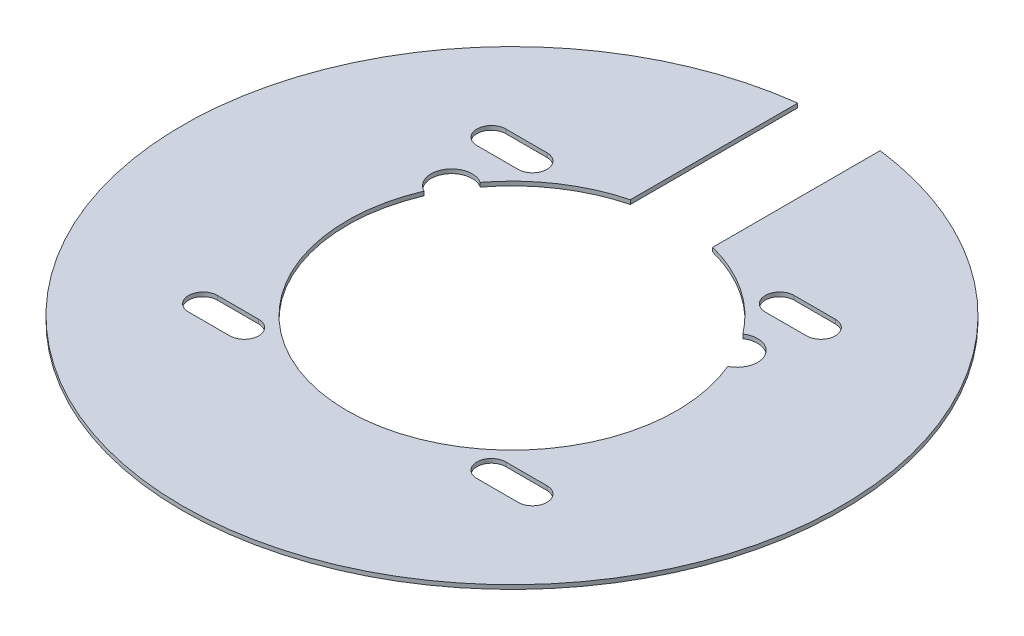
ISO-10303-21;
HEADER;
FILE_DESCRIPTION(('STEP AP214'),'2;1');
FILE_NAME('part.step','',(''),(''),'','','');
FILE_SCHEMA(('AUTOMOTIVE_DESIGN { 1 0 10303 214 1 1 1 1 }'));
ENDSEC;
DATA;
#1=APPLICATION_CONTEXT('core data for automotive mechanical design processes');
#2=APPLICATION_PROTOCOL_DEFINITION('international standard','automotive_design',2000,#1);
#3=PRODUCT_CONTEXT('',#1,'mechanical');
#4=PRODUCT('Part','Part','',(#3));
#5=PRODUCT_RELATED_PRODUCT_CATEGORY('part','',(#4));
#6=PRODUCT_DEFINITION_FORMATION('','',#4);
#7=PRODUCT_DEFINITION_CONTEXT('part definition',#1,'design');
#8=PRODUCT_DEFINITION('design','',#6,#7);
#9=PRODUCT_DEFINITION_SHAPE('','',#8);
#10=(LENGTH_UNIT() NAMED_UNIT(*) SI_UNIT(.MILLI.,.METRE.));
#11=(NAMED_UNIT(*) PLANE_ANGLE_UNIT() SI_UNIT($,.RADIAN.));
#12=(NAMED_UNIT(*) SI_UNIT($,.STERADIAN.) SOLID_ANGLE_UNIT());
#13=UNCERTAINTY_MEASURE_WITH_UNIT(LENGTH_MEASURE(1.E-05),#10,'distance_accuracy_value','');
#14=(GEOMETRIC_REPRESENTATION_CONTEXT(3) GLOBAL_UNCERTAINTY_ASSIGNED_CONTEXT((#13)) GLOBAL_UNIT_ASSIGNED_CONTEXT((#10,
#11,#12)) REPRESENTATION_CONTEXT('',''));
#15=CARTESIAN_POINT('',(0.,0.,0.));
#16=DIRECTION('',(0.,0.,1.));
#17=DIRECTION('',(1.,0.,0.));
#18=AXIS2_PLACEMENT_3D('',#15,#16,#17);
#19=CARTESIAN_POINT('',(0.,1.,0.));
#20=DIRECTION('',(0.,-1.,0.));
#21=DIRECTION('',(0.,0.,-1.));
#22=AXIS2_PLACEMENT_3D('',#19,#20,#21);
#23=CYLINDRICAL_SURFACE('',#22,40.);
#24=CARTESIAN_POINT('',(0.,1.,0.));
#25=DIRECTION('',(0.,-1.,0.));
#26=DIRECTION('',(0.,0.,1.));
#27=AXIS2_PLACEMENT_3D('',#24,#25,#26);
#28=CIRCLE('',#27,40.);
#29=CARTESIAN_POINT('',(-31.8752708029025,1.,-24.1654114643561));
#30=VERTEX_POINT('',#29);
#31=CARTESIAN_POINT('',(-10.,1.,-38.7298334620742));
#32=VERTEX_POINT('',#31);
#33=EDGE_CURVE('E210',#30,#32,#28,.T.);
#34=ORIENTED_EDGE('',*,*,#33,.F.);
#35=DIRECTION('',(0.,1.,0.));
#36=VECTOR('',#35,1.);
#37=CARTESIAN_POINT('',(-31.8752708029025,0.5,-24.1654114643561));
#38=LINE('',#37,#36);
#39=CARTESIAN_POINT('',(-31.8752708029025,0.,-24.1654114643561));
#40=VERTEX_POINT('',#39);
#41=EDGE_CURVE('E199',#30,#40,#38,.F.);
#42=ORIENTED_EDGE('',*,*,#41,.T.);
#43=CARTESIAN_POINT('',(0.,0.,0.));
#44=DIRECTION('',(0.,-1.,0.));
#45=DIRECTION('',(0.,0.,1.));
#46=AXIS2_PLACEMENT_3D('',#43,#44,#45);
#47=CIRCLE('',#46,40.);
#48=CARTESIAN_POINT('',(-10.,0.,-38.7298334620742));
#49=VERTEX_POINT('',#48);
#50=EDGE_CURVE('E208',#40,#49,#47,.T.);
#51=ORIENTED_EDGE('',*,*,#50,.T.);
#52=DIRECTION('',(0.,-1.,0.));
#53=VECTOR('',#52,1.);
#54=CARTESIAN_POINT('',(-10.,1.,-38.7298334620742));
#55=LINE('',#54,#53);
#56=EDGE_CURVE('E239',#32,#49,#55,.T.);
#57=ORIENTED_EDGE('',*,*,#56,.F.);
#58=EDGE_LOOP('',(#34,#42,#51,#57));
#59=FACE_BOUND('',#58,.T.);
#60=ADVANCED_FACE('F40',(#59),#23,.F.);
#61=CARTESIAN_POINT('',(36.8654956224873,0.,-15.522088535644));
#62=VERTEX_POINT('',#61);
#63=CARTESIAN_POINT('',(-36.8654956224873,0.,-15.522088535644));
#64=VERTEX_POINT('',#63);
#65=EDGE_CURVE('E217',#62,#64,#47,.T.);
#66=ORIENTED_EDGE('',*,*,#65,.T.);
#67=DIRECTION('',(0.,1.,0.));
#68=VECTOR('',#67,1.);
#69=CARTESIAN_POINT('',(-36.8654956224873,0.5,-15.522088535644));
#70=LINE('',#69,#68);
#71=CARTESIAN_POINT('',(-36.8654956224873,1.,-15.522088535644));
#72=VERTEX_POINT('',#71);
#73=EDGE_CURVE('E55',#64,#72,#70,.T.);
#74=ORIENTED_EDGE('',*,*,#73,.T.);
#75=CARTESIAN_POINT('',(36.8654956224873,1.,-15.522088535644));
#76=VERTEX_POINT('',#75);
#77=EDGE_CURVE('E278',#76,#72,#28,.T.);
#78=ORIENTED_EDGE('',*,*,#77,.F.);
#79=DIRECTION('',(0.,1.,0.));
#80=VECTOR('',#79,1.);
#81=CARTESIAN_POINT('',(36.8654956224873,0.5,-15.522088535644));
#82=LINE('',#81,#80);
#83=EDGE_CURVE('E289',#76,#62,#82,.F.);
#84=ORIENTED_EDGE('',*,*,#83,.T.);
#85=EDGE_LOOP('',(#66,#74,#78,#84));
#86=FACE_BOUND('',#85,.T.);
#87=ADVANCED_FACE('F484',(#86),#23,.F.);
#88=CARTESIAN_POINT('',(0.,1.,0.));
#89=DIRECTION('',(0.,-1.,0.));
#90=DIRECTION('',(0.,0.,-1.));
#91=AXIS2_PLACEMENT_3D('',#88,#89,#90);
#92=CYLINDRICAL_SURFACE('',#91,80.);
#93=CARTESIAN_POINT('',(0.,0.,0.));
#94=DIRECTION('',(0.,1.,0.));
#95=DIRECTION('',(0.,0.,1.));
#96=AXIS2_PLACEMENT_3D('',#93,#94,#95);
#97=CIRCLE('',#96,80.);
#98=CARTESIAN_POINT('',(-10.,0.,-79.3725393319377));
#99=VERTEX_POINT('',#98);
#100=CARTESIAN_POINT('',(10.,0.,-79.3725393319377));
#101=VERTEX_POINT('',#100);
#102=EDGE_CURVE('E221',#99,#101,#97,.T.);
#103=ORIENTED_EDGE('',*,*,#102,.T.);
#104=DIRECTION('',(0.,-1.,0.));
#105=VECTOR('',#104,1.);
#106=CARTESIAN_POINT('',(10.,1.,-79.3725393319377));
#107=LINE('',#106,#105);
#108=CARTESIAN_POINT('',(10.,1.,-79.3725393319377));
#109=VERTEX_POINT('',#108);
#110=EDGE_CURVE('E48',#109,#101,#107,.T.);
#111=ORIENTED_EDGE('',*,*,#110,.F.);
#112=CARTESIAN_POINT('',(0.,1.,0.));
#113=DIRECTION('',(0.,1.,0.));
#114=DIRECTION('',(0.,0.,1.));
#115=AXIS2_PLACEMENT_3D('',#112,#113,#114);
#116=CIRCLE('',#115,80.);
#117=CARTESIAN_POINT('',(-10.,1.,-79.3725393319377));
#118=VERTEX_POINT('',#117);
#119=EDGE_CURVE('E228',#118,#109,#116,.T.);
#120=ORIENTED_EDGE('',*,*,#119,.F.);
#121=DIRECTION('',(0.,-1.,0.));
#122=VECTOR('',#121,1.);
#123=CARTESIAN_POINT('',(-10.,1.,-79.3725393319377));
#124=LINE('',#123,#122);
#125=EDGE_CURVE('E237',#118,#99,#124,.T.);
#126=ORIENTED_EDGE('',*,*,#125,.T.);
#127=EDGE_LOOP('',(#103,#111,#120,#126));
#128=FACE_BOUND('',#127,.T.);
#129=ADVANCED_FACE('F42',(#128),#92,.T.);
#130=CARTESIAN_POINT('',(10.,1.,-79.3725393319377));
#131=DIRECTION('',(1.,0.,0.));
#132=DIRECTION('',(0.,0.,-1.));
#133=AXIS2_PLACEMENT_3D('',#130,#131,#132);
#134=PLANE('',#133);
#135=DIRECTION('',(0.,0.,1.));
#136=VECTOR('',#135,1.);
#137=CARTESIAN_POINT('',(10.,0.,-79.3725393319377));
#138=LINE('',#137,#136);
#139=CARTESIAN_POINT('',(9.99999999999998,0.,-38.7298334620742));
#140=VERTEX_POINT('',#139);
#141=EDGE_CURVE('E218',#101,#140,#138,.T.);
#142=ORIENTED_EDGE('',*,*,#141,.T.);
#143=DIRECTION('',(0.,-1.,0.));
#144=VECTOR('',#143,1.);
#145=CARTESIAN_POINT('',(9.99999999999998,1.,-38.7298334620742));
#146=LINE('',#145,#144);
#147=CARTESIAN_POINT('',(9.99999999999998,1.,-38.7298334620742));
#148=VERTEX_POINT('',#147);
#149=EDGE_CURVE('E242',#148,#140,#146,.T.);
#150=ORIENTED_EDGE('',*,*,#149,.F.);
#151=DIRECTION('',(0.,0.,1.));
#152=VECTOR('',#151,1.);
#153=CARTESIAN_POINT('',(10.,1.,-79.3725393319377));
#154=LINE('',#153,#152);
#155=EDGE_CURVE('E234',#109,#148,#154,.T.);
#156=ORIENTED_EDGE('',*,*,#155,.F.);
#157=ORIENTED_EDGE('',*,*,#110,.T.);
#158=EDGE_LOOP('',(#142,#150,#156,#157));
#159=FACE_BOUND('',#158,.T.);
#160=ADVANCED_FACE('F247',(#159),#134,.F.);
#161=CARTESIAN_POINT('',(31.8752708029025,0.,-24.1654114643561));
#162=VERTEX_POINT('',#161);
#163=EDGE_CURVE('E220',#140,#162,#47,.T.);
#164=ORIENTED_EDGE('',*,*,#163,.T.);
#165=DIRECTION('',(0.,1.,0.));
#166=VECTOR('',#165,1.);
#167=CARTESIAN_POINT('',(31.8752708029025,0.5,-24.1654114643561));
#168=LINE('',#167,#166);
#169=CARTESIAN_POINT('',(31.8752708029025,1.,-24.1654114643561));
#170=VERTEX_POINT('',#169);
#171=EDGE_CURVE('E62',#162,#170,#168,.T.);
#172=ORIENTED_EDGE('',*,*,#171,.T.);
#173=EDGE_CURVE('E259',#148,#170,#28,.T.);
#174=ORIENTED_EDGE('',*,*,#173,.F.);
#175=ORIENTED_EDGE('',*,*,#149,.T.);
#176=EDGE_LOOP('',(#164,#172,#174,#175));
#177=FACE_BOUND('',#176,.T.);
#178=ADVANCED_FACE('F288',(#177),#23,.F.);
#179=CARTESIAN_POINT('',(-10.,1.,-79.3725393319377));
#180=DIRECTION('',(-1.,0.,0.));
#181=DIRECTION('',(0.,0.,1.));
#182=AXIS2_PLACEMENT_3D('',#179,#180,#181);
#183=PLANE('',#182);
#184=DIRECTION('',(0.,0.,-1.));
#185=VECTOR('',#184,1.);
#186=CARTESIAN_POINT('',(-10.,0.,-79.3725393319377));
#187=LINE('',#186,#185);
#188=EDGE_CURVE('E216',#49,#99,#187,.T.);
#189=ORIENTED_EDGE('',*,*,#188,.T.);
#190=ORIENTED_EDGE('',*,*,#125,.F.);
#191=DIRECTION('',(0.,0.,-1.));
#192=VECTOR('',#191,1.);
#193=CARTESIAN_POINT('',(-10.,1.,-79.3725393319377));
#194=LINE('',#193,#192);
#195=EDGE_CURVE('E240',#32,#118,#194,.T.);
#196=ORIENTED_EDGE('',*,*,#195,.F.);
#197=ORIENTED_EDGE('',*,*,#56,.T.);
#198=EDGE_LOOP('',(#189,#190,#196,#197));
#199=FACE_BOUND('',#198,.T.);
#200=ADVANCED_FACE('F492',(#199),#183,.F.);
#201=CARTESIAN_POINT('',(0.,1.,0.));
#202=DIRECTION('',(0.,1.,0.));
#203=DIRECTION('',(0.,0.,1.));
#204=AXIS2_PLACEMENT_3D('',#201,#202,#203);
#205=PLANE('',#204);
#206=CARTESIAN_POINT('',(-34.6410161513775,1.,-20.0000000000001));
#207=DIRECTION('',(0.,1.,0.));
#208=DIRECTION('',(0.,0.,-1.));
#209=AXIS2_PLACEMENT_3D('',#206,#207,#208);
#210=CIRCLE('',#209,5.);
#211=EDGE_CURVE('E725',#30,#72,#210,.T.);
#212=ORIENTED_EDGE('',*,*,#211,.F.);
#213=ORIENTED_EDGE('',*,*,#33,.T.);
#214=ORIENTED_EDGE('',*,*,#195,.T.);
#215=ORIENTED_EDGE('',*,*,#119,.T.);
#216=ORIENTED_EDGE('',*,*,#155,.T.);
#217=ORIENTED_EDGE('',*,*,#173,.T.);
#218=CARTESIAN_POINT('',(34.6410161513775,1.,-20.0000000000001));
#219=DIRECTION('',(0.,1.,0.));
#220=DIRECTION('',(0.,0.,1.));
#221=AXIS2_PLACEMENT_3D('',#218,#219,#220);
#222=CIRCLE('',#221,5.);
#223=EDGE_CURVE('E211',#76,#170,#222,.T.);
#224=ORIENTED_EDGE('',*,*,#223,.F.);
#225=ORIENTED_EDGE('',*,*,#77,.T.);
#226=EDGE_LOOP('',(#212,#213,#214,#215,#216,#217,#224,#225));
#227=FACE_BOUND('',#226,.T.);
#228=CARTESIAN_POINT('',(30.,1.,-35.));
#229=DIRECTION('',(0.,1.,0.));
#230=DIRECTION('',(0.,0.,1.));
#231=AXIS2_PLACEMENT_3D('',#228,#229,#230);
#232=CIRCLE('',#231,3.5);
#233=CARTESIAN_POINT('',(30.,1.,-38.5));
#234=VERTEX_POINT('',#233);
#235=CARTESIAN_POINT('',(30.,1.,-31.5));
#236=VERTEX_POINT('',#235);
#237=EDGE_CURVE('E313',#234,#236,#232,.T.);
#238=ORIENTED_EDGE('',*,*,#237,.F.);
#239=DIRECTION('',(-1.,0.,0.));
#240=VECTOR('',#239,1.);
#241=CARTESIAN_POINT('',(30.,1.,-38.5));
#242=LINE('',#241,#240);
#243=CARTESIAN_POINT('',(40.,1.,-38.5));
#244=VERTEX_POINT('',#243);
#245=EDGE_CURVE('E303',#244,#234,#242,.T.);
#246=ORIENTED_EDGE('',*,*,#245,.F.);
#247=CARTESIAN_POINT('',(40.,1.,-34.9999999999998));
#248=DIRECTION('',(0.,1.,0.));
#249=DIRECTION('',(0.,0.,1.));
#250=AXIS2_PLACEMENT_3D('',#247,#248,#249);
#251=CIRCLE('',#250,3.5);
#252=CARTESIAN_POINT('',(40.,1.,-31.4999999999998));
#253=VERTEX_POINT('',#252);
#254=EDGE_CURVE('E332',#253,#244,#251,.T.);
#255=ORIENTED_EDGE('',*,*,#254,.F.);
#256=DIRECTION('',(1.,0.,0.));
#257=VECTOR('',#256,1.);
#258=CARTESIAN_POINT('',(30.,1.,-31.5));
#259=LINE('',#258,#257);
#260=EDGE_CURVE('E317',#236,#253,#259,.T.);
#261=ORIENTED_EDGE('',*,*,#260,.F.);
#262=EDGE_LOOP('',(#238,#246,#255,#261));
#263=FACE_BOUND('',#262,.T.);
#264=CARTESIAN_POINT('',(30.,1.,35.));
#265=DIRECTION('',(0.,1.,0.));
#266=DIRECTION('',(0.,0.,1.));
#267=AXIS2_PLACEMENT_3D('',#264,#265,#266);
#268=CIRCLE('',#267,3.50000000000009);
#269=CARTESIAN_POINT('',(30.,1.,31.4999999999999));
#270=VERTEX_POINT('',#269);
#271=CARTESIAN_POINT('',(30.,1.,38.5000000000001));
#272=VERTEX_POINT('',#271);
#273=EDGE_CURVE('E357',#270,#272,#268,.T.);
#274=ORIENTED_EDGE('',*,*,#273,.F.);
#275=DIRECTION('',(-1.,0.,0.));
#276=VECTOR('',#275,1.);
#277=CARTESIAN_POINT('',(30.,1.,31.4999999999999));
#278=LINE('',#277,#276);
#279=CARTESIAN_POINT('',(40.,1.,31.4999999999999));
#280=VERTEX_POINT('',#279);
#281=EDGE_CURVE('E347',#280,#270,#278,.T.);
#282=ORIENTED_EDGE('',*,*,#281,.F.);
#283=CARTESIAN_POINT('',(40.,1.,35.));
#284=DIRECTION('',(0.,1.,0.));
#285=DIRECTION('',(0.,0.,1.));
#286=AXIS2_PLACEMENT_3D('',#283,#284,#285);
#287=CIRCLE('',#286,3.50000000000009);
#288=CARTESIAN_POINT('',(40.,1.,38.5000000000001));
#289=VERTEX_POINT('',#288);
#290=EDGE_CURVE('E374',#289,#280,#287,.T.);
#291=ORIENTED_EDGE('',*,*,#290,.F.);
#292=DIRECTION('',(1.,0.,0.));
#293=VECTOR('',#292,1.);
#294=CARTESIAN_POINT('',(30.,1.,38.5000000000001));
#295=LINE('',#294,#293);
#296=EDGE_CURVE('E361',#272,#289,#295,.T.);
#297=ORIENTED_EDGE('',*,*,#296,.F.);
#298=EDGE_LOOP('',(#274,#282,#291,#297));
#299=FACE_BOUND('',#298,.T.);
#300=CARTESIAN_POINT('',(-40.,1.,34.9999999999999));
#301=DIRECTION('',(0.,1.,0.));
#302=DIRECTION('',(0.,0.,1.));
#303=AXIS2_PLACEMENT_3D('',#300,#301,#302);
#304=CIRCLE('',#303,3.50000000000009);
#305=CARTESIAN_POINT('',(-40.,1.,31.4999999999999));
#306=VERTEX_POINT('',#305);
#307=CARTESIAN_POINT('',(-40.,1.,38.5000000000001));
#308=VERTEX_POINT('',#307);
#309=EDGE_CURVE('E293',#306,#308,#304,.T.);
#310=ORIENTED_EDGE('',*,*,#309,.F.);
#311=DIRECTION('',(-1.,0.,0.));
#312=VECTOR('',#311,1.);
#313=CARTESIAN_POINT('',(-40.,1.,31.4999999999999));
#314=LINE('',#313,#312);
#315=CARTESIAN_POINT('',(-30.,1.,31.4999999999999));
#316=VERTEX_POINT('',#315);
#317=EDGE_CURVE('E387',#316,#306,#314,.T.);
#318=ORIENTED_EDGE('',*,*,#317,.F.);
#319=CARTESIAN_POINT('',(-30.,1.,35.0000000000001));
#320=DIRECTION('',(0.,1.,0.));
#321=DIRECTION('',(0.,0.,1.));
#322=AXIS2_PLACEMENT_3D('',#319,#320,#321);
#323=CIRCLE('',#322,3.50000000000009);
#324=CARTESIAN_POINT('',(-30.,1.,38.5000000000002));
#325=VERTEX_POINT('',#324);
#326=EDGE_CURVE('E412',#325,#316,#323,.T.);
#327=ORIENTED_EDGE('',*,*,#326,.F.);
#328=DIRECTION('',(1.,0.,0.));
#329=VECTOR('',#328,1.);
#330=CARTESIAN_POINT('',(-40.,1.,38.5000000000001));
#331=LINE('',#330,#329);
#332=EDGE_CURVE('E400',#308,#325,#331,.T.);
#333=ORIENTED_EDGE('',*,*,#332,.F.);
#334=EDGE_LOOP('',(#310,#318,#327,#333));
#335=FACE_BOUND('',#334,.T.);
#336=CARTESIAN_POINT('',(-40.,1.,-35.));
#337=DIRECTION('',(0.,1.,0.));
#338=DIRECTION('',(0.,0.,1.));
#339=AXIS2_PLACEMENT_3D('',#336,#337,#338);
#340=CIRCLE('',#339,3.5);
#341=CARTESIAN_POINT('',(-40.,1.,-38.5));
#342=VERTEX_POINT('',#341);
#343=CARTESIAN_POINT('',(-40.,1.,-31.5));
#344=VERTEX_POINT('',#343);
#345=EDGE_CURVE('E336',#342,#344,#340,.T.);
#346=ORIENTED_EDGE('',*,*,#345,.F.);
#347=DIRECTION('',(-1.,0.,0.));
#348=VECTOR('',#347,1.);
#349=CARTESIAN_POINT('',(-40.,1.,-38.5));
#350=LINE('',#349,#348);
#351=CARTESIAN_POINT('',(-30.,1.,-38.5));
#352=VERTEX_POINT('',#351);
#353=EDGE_CURVE('E425',#352,#342,#350,.T.);
#354=ORIENTED_EDGE('',*,*,#353,.F.);
#355=CARTESIAN_POINT('',(-30.,1.,-35.));
#356=DIRECTION('',(0.,1.,0.));
#357=DIRECTION('',(0.,0.,1.));
#358=AXIS2_PLACEMENT_3D('',#355,#356,#357);
#359=CIRCLE('',#358,3.5);
#360=CARTESIAN_POINT('',(-30.,1.,-31.5));
#361=VERTEX_POINT('',#360);
#362=EDGE_CURVE('E445',#361,#352,#359,.T.);
#363=ORIENTED_EDGE('',*,*,#362,.F.);
#364=DIRECTION('',(1.,0.,0.));
#365=VECTOR('',#364,1.);
#366=CARTESIAN_POINT('',(-40.,1.,-31.5));
#367=LINE('',#366,#365);
#368=EDGE_CURVE('E436',#344,#361,#367,.T.);
#369=ORIENTED_EDGE('',*,*,#368,.F.);
#370=EDGE_LOOP('',(#346,#354,#363,#369));
#371=FACE_BOUND('',#370,.T.);
#372=ADVANCED_FACE('F285',(#227,#263,#299,#335,#371),#205,.T.);
#373=CARTESIAN_POINT('',(0.,0.,0.));
#374=DIRECTION('',(0.,1.,0.));
#375=DIRECTION('',(0.,0.,1.));
#376=AXIS2_PLACEMENT_3D('',#373,#374,#375);
#377=PLANE('',#376);
#378=DIRECTION('',(-1.,0.,0.));
#379=VECTOR('',#378,1.);
#380=CARTESIAN_POINT('',(30.,0.,-38.5));
#381=LINE('',#380,#379);
#382=CARTESIAN_POINT('',(40.,0.,-38.5));
#383=VERTEX_POINT('',#382);
#384=CARTESIAN_POINT('',(30.,0.,-38.5));
#385=VERTEX_POINT('',#384);
#386=EDGE_CURVE('E309',#383,#385,#381,.T.);
#387=ORIENTED_EDGE('',*,*,#386,.T.);
#388=CARTESIAN_POINT('',(30.,0.,-35.));
#389=DIRECTION('',(0.,1.,0.));
#390=DIRECTION('',(0.,0.,1.));
#391=AXIS2_PLACEMENT_3D('',#388,#389,#390);
#392=CIRCLE('',#391,3.5);
#393=CARTESIAN_POINT('',(30.,0.,-31.5));
#394=VERTEX_POINT('',#393);
#395=EDGE_CURVE('E299',#385,#394,#392,.T.);
#396=ORIENTED_EDGE('',*,*,#395,.T.);
#397=DIRECTION('',(1.,0.,0.));
#398=VECTOR('',#397,1.);
#399=CARTESIAN_POINT('',(30.,0.,-31.5));
#400=LINE('',#399,#398);
#401=CARTESIAN_POINT('',(40.,0.,-31.5));
#402=VERTEX_POINT('',#401);
#403=EDGE_CURVE('E302',#394,#402,#400,.T.);
#404=ORIENTED_EDGE('',*,*,#403,.T.);
#405=CARTESIAN_POINT('',(40.,0.,-34.9999999999998));
#406=DIRECTION('',(0.,1.,0.));
#407=DIRECTION('',(0.,0.,1.));
#408=AXIS2_PLACEMENT_3D('',#405,#406,#407);
#409=CIRCLE('',#408,3.5);
#410=EDGE_CURVE('E306',#402,#383,#409,.T.);
#411=ORIENTED_EDGE('',*,*,#410,.T.);
#412=EDGE_LOOP('',(#387,#396,#404,#411));
#413=FACE_BOUND('',#412,.T.);
#414=DIRECTION('',(-1.,0.,0.));
#415=VECTOR('',#414,1.);
#416=CARTESIAN_POINT('',(30.,0.,31.4999999999999));
#417=LINE('',#416,#415);
#418=CARTESIAN_POINT('',(40.,0.,31.4999999999999));
#419=VERTEX_POINT('',#418);
#420=CARTESIAN_POINT('',(30.,0.,31.4999999999999));
#421=VERTEX_POINT('',#420);
#422=EDGE_CURVE('E353',#419,#421,#417,.T.);
#423=ORIENTED_EDGE('',*,*,#422,.T.);
#424=CARTESIAN_POINT('',(30.,0.,35.));
#425=DIRECTION('',(0.,1.,0.));
#426=DIRECTION('',(0.,0.,1.));
#427=AXIS2_PLACEMENT_3D('',#424,#425,#426);
#428=CIRCLE('',#427,3.50000000000009);
#429=CARTESIAN_POINT('',(30.,0.,38.5000000000001));
#430=VERTEX_POINT('',#429);
#431=EDGE_CURVE('E343',#421,#430,#428,.T.);
#432=ORIENTED_EDGE('',*,*,#431,.T.);
#433=DIRECTION('',(1.,0.,0.));
#434=VECTOR('',#433,1.);
#435=CARTESIAN_POINT('',(30.,0.,38.5000000000001));
#436=LINE('',#435,#434);
#437=CARTESIAN_POINT('',(40.,0.,38.5000000000001));
#438=VERTEX_POINT('',#437);
#439=EDGE_CURVE('E346',#430,#438,#436,.T.);
#440=ORIENTED_EDGE('',*,*,#439,.T.);
#441=CARTESIAN_POINT('',(40.,0.,35.));
#442=DIRECTION('',(0.,1.,0.));
#443=DIRECTION('',(0.,0.,1.));
#444=AXIS2_PLACEMENT_3D('',#441,#442,#443);
#445=CIRCLE('',#444,3.50000000000009);
#446=EDGE_CURVE('E350',#438,#419,#445,.T.);
#447=ORIENTED_EDGE('',*,*,#446,.T.);
#448=EDGE_LOOP('',(#423,#432,#440,#447));
#449=FACE_BOUND('',#448,.T.);
#450=DIRECTION('',(-1.,0.,0.));
#451=VECTOR('',#450,1.);
#452=CARTESIAN_POINT('',(-40.,0.,31.4999999999999));
#453=LINE('',#452,#451);
#454=CARTESIAN_POINT('',(-30.,0.,31.4999999999999));
#455=VERTEX_POINT('',#454);
#456=CARTESIAN_POINT('',(-40.,0.,31.4999999999999));
#457=VERTEX_POINT('',#456);
#458=EDGE_CURVE('E393',#455,#457,#453,.T.);
#459=ORIENTED_EDGE('',*,*,#458,.T.);
#460=CARTESIAN_POINT('',(-40.,0.,34.9999999999999));
#461=DIRECTION('',(0.,1.,0.));
#462=DIRECTION('',(0.,0.,1.));
#463=AXIS2_PLACEMENT_3D('',#460,#461,#462);
#464=CIRCLE('',#463,3.50000000000009);
#465=CARTESIAN_POINT('',(-40.,0.,38.5000000000001));
#466=VERTEX_POINT('',#465);
#467=EDGE_CURVE('E383',#457,#466,#464,.T.);
#468=ORIENTED_EDGE('',*,*,#467,.T.);
#469=DIRECTION('',(1.,0.,0.));
#470=VECTOR('',#469,1.);
#471=CARTESIAN_POINT('',(-40.,0.,38.5000000000001));
#472=LINE('',#471,#470);
#473=CARTESIAN_POINT('',(-30.,0.,38.5000000000001));
#474=VERTEX_POINT('',#473);
#475=EDGE_CURVE('E386',#466,#474,#472,.T.);
#476=ORIENTED_EDGE('',*,*,#475,.T.);
#477=CARTESIAN_POINT('',(-30.,0.,35.0000000000001));
#478=DIRECTION('',(0.,1.,0.));
#479=DIRECTION('',(0.,0.,1.));
#480=AXIS2_PLACEMENT_3D('',#477,#478,#479);
#481=CIRCLE('',#480,3.50000000000009);
#482=EDGE_CURVE('E390',#474,#455,#481,.T.);
#483=ORIENTED_EDGE('',*,*,#482,.T.);
#484=EDGE_LOOP('',(#459,#468,#476,#483));
#485=FACE_BOUND('',#484,.T.);
#486=DIRECTION('',(-1.,0.,0.));
#487=VECTOR('',#486,1.);
#488=CARTESIAN_POINT('',(-40.,0.,-38.5));
#489=LINE('',#488,#487);
#490=CARTESIAN_POINT('',(-30.,0.,-38.5));
#491=VERTEX_POINT('',#490);
#492=CARTESIAN_POINT('',(-40.,0.,-38.5));
#493=VERTEX_POINT('',#492);
#494=EDGE_CURVE('E431',#491,#493,#489,.T.);
#495=ORIENTED_EDGE('',*,*,#494,.T.);
#496=CARTESIAN_POINT('',(-40.,0.,-35.));
#497=DIRECTION('',(0.,1.,0.));
#498=DIRECTION('',(0.,0.,1.));
#499=AXIS2_PLACEMENT_3D('',#496,#497,#498);
#500=CIRCLE('',#499,3.5);
#501=CARTESIAN_POINT('',(-40.,0.,-31.5));
#502=VERTEX_POINT('',#501);
#503=EDGE_CURVE('E421',#493,#502,#500,.T.);
#504=ORIENTED_EDGE('',*,*,#503,.T.);
#505=DIRECTION('',(1.,0.,0.));
#506=VECTOR('',#505,1.);
#507=CARTESIAN_POINT('',(-40.,0.,-31.5));
#508=LINE('',#507,#506);
#509=CARTESIAN_POINT('',(-30.,0.,-31.5));
#510=VERTEX_POINT('',#509);
#511=EDGE_CURVE('E424',#502,#510,#508,.T.);
#512=ORIENTED_EDGE('',*,*,#511,.T.);
#513=CARTESIAN_POINT('',(-30.,0.,-35.));
#514=DIRECTION('',(0.,1.,0.));
#515=DIRECTION('',(0.,0.,1.));
#516=AXIS2_PLACEMENT_3D('',#513,#514,#515);
#517=CIRCLE('',#516,3.5);
#518=EDGE_CURVE('E428',#510,#491,#517,.T.);
#519=ORIENTED_EDGE('',*,*,#518,.T.);
#520=EDGE_LOOP('',(#495,#504,#512,#519));
#521=FACE_BOUND('',#520,.T.);
#522=ORIENTED_EDGE('',*,*,#50,.F.);
#523=CARTESIAN_POINT('',(-34.6410161513775,0.,-20.0000000000001));
#524=DIRECTION('',(0.,1.,0.));
#525=DIRECTION('',(0.,0.,1.));
#526=AXIS2_PLACEMENT_3D('',#523,#524,#525);
#527=CIRCLE('',#526,5.);
#528=EDGE_CURVE('E12',#40,#64,#527,.T.);
#529=ORIENTED_EDGE('',*,*,#528,.T.);
#530=ORIENTED_EDGE('',*,*,#65,.F.);
#531=CARTESIAN_POINT('',(34.6410161513775,0.,-20.0000000000001));
#532=DIRECTION('',(0.,1.,0.));
#533=DIRECTION('',(0.,0.,1.));
#534=AXIS2_PLACEMENT_3D('',#531,#532,#533);
#535=CIRCLE('',#534,5.);
#536=EDGE_CURVE('E290',#62,#162,#535,.T.);
#537=ORIENTED_EDGE('',*,*,#536,.T.);
#538=ORIENTED_EDGE('',*,*,#163,.F.);
#539=ORIENTED_EDGE('',*,*,#141,.F.);
#540=ORIENTED_EDGE('',*,*,#102,.F.);
#541=ORIENTED_EDGE('',*,*,#188,.F.);
#542=EDGE_LOOP('',(#522,#529,#530,#537,#538,#539,#540,#541));
#543=FACE_BOUND('',#542,.T.);
#544=ADVANCED_FACE('F214',(#413,#449,#485,#521,#543),#377,.F.);
#545=CARTESIAN_POINT('',(-40.,0.,-35.));
#546=DIRECTION('',(0.,1.,0.));
#547=DIRECTION('',(0.,0.,1.));
#548=AXIS2_PLACEMENT_3D('',#545,#546,#547);
#549=CYLINDRICAL_SURFACE('',#548,3.5);
#550=ORIENTED_EDGE('',*,*,#345,.T.);
#551=DIRECTION('',(0.,1.,0.));
#552=VECTOR('',#551,1.);
#553=CARTESIAN_POINT('',(-40.,0.,-31.5));
#554=LINE('',#553,#552);
#555=EDGE_CURVE('E270',#502,#344,#554,.T.);
#556=ORIENTED_EDGE('',*,*,#555,.F.);
#557=ORIENTED_EDGE('',*,*,#503,.F.);
#558=DIRECTION('',(0.,1.,0.));
#559=VECTOR('',#558,1.);
#560=CARTESIAN_POINT('',(-40.,0.,-38.5));
#561=LINE('',#560,#559);
#562=EDGE_CURVE('E251',#493,#342,#561,.T.);
#563=ORIENTED_EDGE('',*,*,#562,.T.);
#564=EDGE_LOOP('',(#550,#556,#557,#563));
#565=FACE_BOUND('',#564,.T.);
#566=ADVANCED_FACE('F471',(#565),#549,.F.);
#567=CARTESIAN_POINT('',(-40.,0.,-38.5));
#568=DIRECTION('',(0.,0.,-1.));
#569=DIRECTION('',(-1.,0.,0.));
#570=AXIS2_PLACEMENT_3D('',#567,#568,#569);
#571=PLANE('',#570);
#572=ORIENTED_EDGE('',*,*,#353,.T.);
#573=ORIENTED_EDGE('',*,*,#562,.F.);
#574=ORIENTED_EDGE('',*,*,#494,.F.);
#575=DIRECTION('',(0.,1.,0.));
#576=VECTOR('',#575,1.);
#577=CARTESIAN_POINT('',(-30.,0.,-38.5));
#578=LINE('',#577,#576);
#579=EDGE_CURVE('E253',#491,#352,#578,.T.);
#580=ORIENTED_EDGE('',*,*,#579,.T.);
#581=EDGE_LOOP('',(#572,#573,#574,#580));
#582=FACE_BOUND('',#581,.T.);
#583=ADVANCED_FACE('F469',(#582),#571,.F.);
#584=CARTESIAN_POINT('',(-30.,0.,-35.));
#585=DIRECTION('',(0.,1.,0.));
#586=DIRECTION('',(0.,0.,1.));
#587=AXIS2_PLACEMENT_3D('',#584,#585,#586);
#588=CYLINDRICAL_SURFACE('',#587,3.5);
#589=ORIENTED_EDGE('',*,*,#362,.T.);
#590=ORIENTED_EDGE('',*,*,#579,.F.);
#591=ORIENTED_EDGE('',*,*,#518,.F.);
#592=DIRECTION('',(0.,1.,0.));
#593=VECTOR('',#592,1.);
#594=CARTESIAN_POINT('',(-30.,0.,-31.5));
#595=LINE('',#594,#593);
#596=EDGE_CURVE('E448',#510,#361,#595,.T.);
#597=ORIENTED_EDGE('',*,*,#596,.T.);
#598=EDGE_LOOP('',(#589,#590,#591,#597));
#599=FACE_BOUND('',#598,.T.);
#600=ADVANCED_FACE('F466',(#599),#588,.F.);
#601=CARTESIAN_POINT('',(-40.,0.,-31.5));
#602=DIRECTION('',(0.,0.,1.));
#603=DIRECTION('',(1.,0.,0.));
#604=AXIS2_PLACEMENT_3D('',#601,#602,#603);
#605=PLANE('',#604);
#606=ORIENTED_EDGE('',*,*,#368,.T.);
#607=ORIENTED_EDGE('',*,*,#596,.F.);
#608=ORIENTED_EDGE('',*,*,#511,.F.);
#609=ORIENTED_EDGE('',*,*,#555,.T.);
#610=EDGE_LOOP('',(#606,#607,#608,#609));
#611=FACE_BOUND('',#610,.T.);
#612=ADVANCED_FACE('F457',(#611),#605,.F.);
#613=CARTESIAN_POINT('',(-40.,0.,34.9999999999999));
#614=DIRECTION('',(0.,1.,0.));
#615=DIRECTION('',(0.,0.,1.));
#616=AXIS2_PLACEMENT_3D('',#613,#614,#615);
#617=CYLINDRICAL_SURFACE('',#616,3.50000000000009);
#618=ORIENTED_EDGE('',*,*,#309,.T.);
#619=DIRECTION('',(0.,1.,0.));
#620=VECTOR('',#619,1.);
#621=CARTESIAN_POINT('',(-40.,0.,38.5000000000001));
#622=LINE('',#621,#620);
#623=EDGE_CURVE('E396',#466,#308,#622,.T.);
#624=ORIENTED_EDGE('',*,*,#623,.F.);
#625=ORIENTED_EDGE('',*,*,#467,.F.);
#626=DIRECTION('',(0.,1.,0.));
#627=VECTOR('',#626,1.);
#628=CARTESIAN_POINT('',(-40.,0.,31.4999999999999));
#629=LINE('',#628,#627);
#630=EDGE_CURVE('E362',#457,#306,#629,.T.);
#631=ORIENTED_EDGE('',*,*,#630,.T.);
#632=EDGE_LOOP('',(#618,#624,#625,#631));
#633=FACE_BOUND('',#632,.T.);
#634=ADVANCED_FACE('F589',(#633),#617,.F.);
#635=CARTESIAN_POINT('',(-40.,0.,31.4999999999999));
#636=DIRECTION('',(0.,0.,-1.));
#637=DIRECTION('',(-1.,0.,0.));
#638=AXIS2_PLACEMENT_3D('',#635,#636,#637);
#639=PLANE('',#638);
#640=ORIENTED_EDGE('',*,*,#317,.T.);
#641=ORIENTED_EDGE('',*,*,#630,.F.);
#642=ORIENTED_EDGE('',*,*,#458,.F.);
#643=DIRECTION('',(0.,1.,0.));
#644=VECTOR('',#643,1.);
#645=CARTESIAN_POINT('',(-30.,0.,31.4999999999999));
#646=LINE('',#645,#644);
#647=EDGE_CURVE('E415',#455,#316,#646,.T.);
#648=ORIENTED_EDGE('',*,*,#647,.T.);
#649=EDGE_LOOP('',(#640,#641,#642,#648));
#650=FACE_BOUND('',#649,.T.);
#651=ADVANCED_FACE('F585',(#650),#639,.F.);
#652=CARTESIAN_POINT('',(-30.,0.,35.0000000000001));
#653=DIRECTION('',(0.,1.,0.));
#654=DIRECTION('',(0.,0.,1.));
#655=AXIS2_PLACEMENT_3D('',#652,#653,#654);
#656=CYLINDRICAL_SURFACE('',#655,3.50000000000009);
#657=ORIENTED_EDGE('',*,*,#326,.T.);
#658=ORIENTED_EDGE('',*,*,#647,.F.);
#659=ORIENTED_EDGE('',*,*,#482,.F.);
#660=DIRECTION('',(0.,1.,0.));
#661=VECTOR('',#660,1.);
#662=CARTESIAN_POINT('',(-30.,0.,38.5000000000002));
#663=LINE('',#662,#661);
#664=EDGE_CURVE('E417',#474,#325,#663,.T.);
#665=ORIENTED_EDGE('',*,*,#664,.T.);
#666=EDGE_LOOP('',(#657,#658,#659,#665));
#667=FACE_BOUND('',#666,.T.);
#668=ADVANCED_FACE('F588',(#667),#656,.F.);
#669=CARTESIAN_POINT('',(-40.,0.,38.5000000000001));
#670=DIRECTION('',(0.,0.,1.));
#671=DIRECTION('',(1.,0.,0.));
#672=AXIS2_PLACEMENT_3D('',#669,#670,#671);
#673=PLANE('',#672);
#674=ORIENTED_EDGE('',*,*,#332,.T.);
#675=ORIENTED_EDGE('',*,*,#664,.F.);
#676=ORIENTED_EDGE('',*,*,#475,.F.);
#677=ORIENTED_EDGE('',*,*,#623,.T.);
#678=EDGE_LOOP('',(#674,#675,#676,#677));
#679=FACE_BOUND('',#678,.T.);
#680=ADVANCED_FACE('F583',(#679),#673,.F.);
#681=CARTESIAN_POINT('',(30.,0.,35.));
#682=DIRECTION('',(0.,1.,0.));
#683=DIRECTION('',(0.,0.,1.));
#684=AXIS2_PLACEMENT_3D('',#681,#682,#683);
#685=CYLINDRICAL_SURFACE('',#684,3.50000000000009);
#686=ORIENTED_EDGE('',*,*,#273,.T.);
#687=DIRECTION('',(0.,1.,0.));
#688=VECTOR('',#687,1.);
#689=CARTESIAN_POINT('',(30.,0.,38.5000000000001));
#690=LINE('',#689,#688);
#691=EDGE_CURVE('E356',#430,#272,#690,.T.);
#692=ORIENTED_EDGE('',*,*,#691,.F.);
#693=ORIENTED_EDGE('',*,*,#431,.F.);
#694=DIRECTION('',(0.,1.,0.));
#695=VECTOR('',#694,1.);
#696=CARTESIAN_POINT('',(30.,0.,31.4999999999999));
#697=LINE('',#696,#695);
#698=EDGE_CURVE('E318',#421,#270,#697,.T.);
#699=ORIENTED_EDGE('',*,*,#698,.T.);
#700=EDGE_LOOP('',(#686,#692,#693,#699));
#701=FACE_BOUND('',#700,.T.);
#702=ADVANCED_FACE('F573',(#701),#685,.F.);
#703=CARTESIAN_POINT('',(30.,0.,31.4999999999999));
#704=DIRECTION('',(0.,0.,-1.));
#705=DIRECTION('',(-1.,0.,0.));
#706=AXIS2_PLACEMENT_3D('',#703,#704,#705);
#707=PLANE('',#706);
#708=ORIENTED_EDGE('',*,*,#281,.T.);
#709=ORIENTED_EDGE('',*,*,#698,.F.);
#710=ORIENTED_EDGE('',*,*,#422,.F.);
#711=DIRECTION('',(0.,1.,0.));
#712=VECTOR('',#711,1.);
#713=CARTESIAN_POINT('',(40.,0.,31.4999999999999));
#714=LINE('',#713,#712);
#715=EDGE_CURVE('E377',#419,#280,#714,.T.);
#716=ORIENTED_EDGE('',*,*,#715,.T.);
#717=EDGE_LOOP('',(#708,#709,#710,#716));
#718=FACE_BOUND('',#717,.T.);
#719=ADVANCED_FACE('F569',(#718),#707,.F.);
#720=CARTESIAN_POINT('',(40.,0.,35.));
#721=DIRECTION('',(0.,1.,0.));
#722=DIRECTION('',(0.,0.,1.));
#723=AXIS2_PLACEMENT_3D('',#720,#721,#722);
#724=CYLINDRICAL_SURFACE('',#723,3.50000000000009);
#725=ORIENTED_EDGE('',*,*,#290,.T.);
#726=ORIENTED_EDGE('',*,*,#715,.F.);
#727=ORIENTED_EDGE('',*,*,#446,.F.);
#728=DIRECTION('',(0.,1.,0.));
#729=VECTOR('',#728,1.);
#730=CARTESIAN_POINT('',(40.,0.,38.5000000000001));
#731=LINE('',#730,#729);
#732=EDGE_CURVE('E379',#438,#289,#731,.T.);
#733=ORIENTED_EDGE('',*,*,#732,.T.);
#734=EDGE_LOOP('',(#725,#726,#727,#733));
#735=FACE_BOUND('',#734,.T.);
#736=ADVANCED_FACE('F572',(#735),#724,.F.);
#737=CARTESIAN_POINT('',(30.,0.,38.5000000000001));
#738=DIRECTION('',(0.,0.,1.));
#739=DIRECTION('',(1.,0.,0.));
#740=AXIS2_PLACEMENT_3D('',#737,#738,#739);
#741=PLANE('',#740);
#742=ORIENTED_EDGE('',*,*,#296,.T.);
#743=ORIENTED_EDGE('',*,*,#732,.F.);
#744=ORIENTED_EDGE('',*,*,#439,.F.);
#745=ORIENTED_EDGE('',*,*,#691,.T.);
#746=EDGE_LOOP('',(#742,#743,#744,#745));
#747=FACE_BOUND('',#746,.T.);
#748=ADVANCED_FACE('F567',(#747),#741,.F.);
#749=CARTESIAN_POINT('',(30.,0.,-35.));
#750=DIRECTION('',(0.,1.,0.));
#751=DIRECTION('',(0.,0.,1.));
#752=AXIS2_PLACEMENT_3D('',#749,#750,#751);
#753=CYLINDRICAL_SURFACE('',#752,3.5);
#754=ORIENTED_EDGE('',*,*,#237,.T.);
#755=DIRECTION('',(0.,1.,0.));
#756=VECTOR('',#755,1.);
#757=CARTESIAN_POINT('',(30.,0.,-31.5));
#758=LINE('',#757,#756);
#759=EDGE_CURVE('E312',#394,#236,#758,.T.);
#760=ORIENTED_EDGE('',*,*,#759,.F.);
#761=ORIENTED_EDGE('',*,*,#395,.F.);
#762=DIRECTION('',(0.,1.,0.));
#763=VECTOR('',#762,1.);
#764=CARTESIAN_POINT('',(30.,0.,-38.5));
#765=LINE('',#764,#763);
#766=EDGE_CURVE('E334',#385,#234,#765,.T.);
#767=ORIENTED_EDGE('',*,*,#766,.T.);
#768=EDGE_LOOP('',(#754,#760,#761,#767));
#769=FACE_BOUND('',#768,.T.);
#770=ADVANCED_FACE('F558',(#769),#753,.F.);
#771=CARTESIAN_POINT('',(30.,0.,-38.5));
#772=DIRECTION('',(0.,0.,-1.));
#773=DIRECTION('',(-1.,0.,0.));
#774=AXIS2_PLACEMENT_3D('',#771,#772,#773);
#775=PLANE('',#774);
#776=ORIENTED_EDGE('',*,*,#245,.T.);
#777=ORIENTED_EDGE('',*,*,#766,.F.);
#778=ORIENTED_EDGE('',*,*,#386,.F.);
#779=DIRECTION('',(0.,1.,0.));
#780=VECTOR('',#779,1.);
#781=CARTESIAN_POINT('',(40.,0.,-38.5));
#782=LINE('',#781,#780);
#783=EDGE_CURVE('E337',#383,#244,#782,.T.);
#784=ORIENTED_EDGE('',*,*,#783,.T.);
#785=EDGE_LOOP('',(#776,#777,#778,#784));
#786=FACE_BOUND('',#785,.T.);
#787=ADVANCED_FACE('F554',(#786),#775,.F.);
#788=CARTESIAN_POINT('',(40.,0.,-34.9999999999998));
#789=DIRECTION('',(0.,1.,0.));
#790=DIRECTION('',(0.,0.,1.));
#791=AXIS2_PLACEMENT_3D('',#788,#789,#790);
#792=CYLINDRICAL_SURFACE('',#791,3.5);
#793=ORIENTED_EDGE('',*,*,#254,.T.);
#794=ORIENTED_EDGE('',*,*,#783,.F.);
#795=ORIENTED_EDGE('',*,*,#410,.F.);
#796=DIRECTION('',(0.,1.,0.));
#797=VECTOR('',#796,1.);
#798=CARTESIAN_POINT('',(40.,0.,-31.4999999999998));
#799=LINE('',#798,#797);
#800=EDGE_CURVE('E339',#402,#253,#799,.T.);
#801=ORIENTED_EDGE('',*,*,#800,.T.);
#802=EDGE_LOOP('',(#793,#794,#795,#801));
#803=FACE_BOUND('',#802,.T.);
#804=ADVANCED_FACE('F557',(#803),#792,.F.);
#805=CARTESIAN_POINT('',(30.,0.,-31.5));
#806=DIRECTION('',(0.,0.,1.));
#807=DIRECTION('',(1.,0.,0.));
#808=AXIS2_PLACEMENT_3D('',#805,#806,#807);
#809=PLANE('',#808);
#810=ORIENTED_EDGE('',*,*,#260,.T.);
#811=ORIENTED_EDGE('',*,*,#800,.F.);
#812=ORIENTED_EDGE('',*,*,#403,.F.);
#813=ORIENTED_EDGE('',*,*,#759,.T.);
#814=EDGE_LOOP('',(#810,#811,#812,#813));
#815=FACE_BOUND('',#814,.T.);
#816=ADVANCED_FACE('F540',(#815),#809,.F.);
#817=CARTESIAN_POINT('',(34.6410161513775,0.,-20.0000000000001));
#818=DIRECTION('',(0.,1.,0.));
#819=DIRECTION('',(0.,0.,1.));
#820=AXIS2_PLACEMENT_3D('',#817,#818,#819);
#821=CYLINDRICAL_SURFACE('',#820,5.);
#822=ORIENTED_EDGE('',*,*,#223,.T.);
#823=ORIENTED_EDGE('',*,*,#171,.F.);
#824=ORIENTED_EDGE('',*,*,#536,.F.);
#825=ORIENTED_EDGE('',*,*,#83,.F.);
#826=EDGE_LOOP('',(#822,#823,#824,#825));
#827=FACE_BOUND('',#826,.T.);
#828=ADVANCED_FACE('F535',(#827),#821,.F.);
#829=CARTESIAN_POINT('',(-34.6410161513775,0.,-20.0000000000001));
#830=DIRECTION('',(0.,1.,0.));
#831=DIRECTION('',(0.,0.,1.));
#832=AXIS2_PLACEMENT_3D('',#829,#830,#831);
#833=CYLINDRICAL_SURFACE('',#832,5.);
#834=ORIENTED_EDGE('',*,*,#211,.T.);
#835=ORIENTED_EDGE('',*,*,#73,.F.);
#836=ORIENTED_EDGE('',*,*,#528,.F.);
#837=ORIENTED_EDGE('',*,*,#41,.F.);
#838=EDGE_LOOP('',(#834,#835,#836,#837));
#839=FACE_BOUND('',#838,.T.);
#840=ADVANCED_FACE('F198',(#839),#833,.F.);
#841=CLOSED_SHELL('',(#60,#87,#129,#160,#178,#200,#372,#544,#566,#583,#600,#612,#634,#651,#668,
#680,#702,#719,#736,#748,#770,#787,#804,#816,#828,#840));
#842=MANIFOLD_SOLID_BREP('B2',#841);
#843=ADVANCED_BREP_SHAPE_REPRESENTATION('',(#18,#842),#14);
#844=SHAPE_DEFINITION_REPRESENTATION(#9,#843);
ENDSEC;
END-ISO-10303-21;
